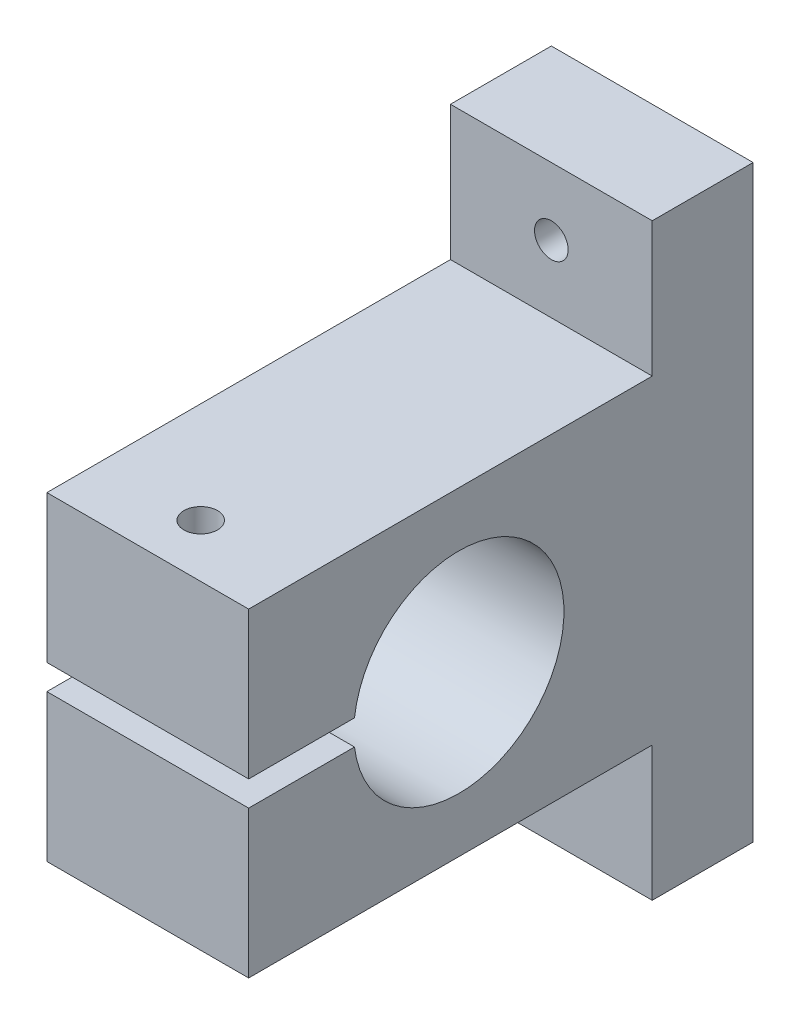
ISO-10303-21;
HEADER;
FILE_DESCRIPTION(('STEP AP214'),'2;1');
FILE_NAME('part.step','',(''),(''),'','','');
FILE_SCHEMA(('AUTOMOTIVE_DESIGN { 1 0 10303 214 1 1 1 1 }'));
ENDSEC;
DATA;
#1=APPLICATION_CONTEXT('core data for automotive mechanical design processes');
#2=APPLICATION_PROTOCOL_DEFINITION('international standard','automotive_design',2000,#1);
#3=PRODUCT_CONTEXT('',#1,'mechanical');
#4=PRODUCT('Part','Part','',(#3));
#5=PRODUCT_RELATED_PRODUCT_CATEGORY('part','',(#4));
#6=PRODUCT_DEFINITION_FORMATION('','',#4);
#7=PRODUCT_DEFINITION_CONTEXT('part definition',#1,'design');
#8=PRODUCT_DEFINITION('design','',#6,#7);
#9=PRODUCT_DEFINITION_SHAPE('','',#8);
#10=(LENGTH_UNIT() NAMED_UNIT(*) SI_UNIT(.MILLI.,.METRE.));
#11=(NAMED_UNIT(*) PLANE_ANGLE_UNIT() SI_UNIT($,.RADIAN.));
#12=(NAMED_UNIT(*) SI_UNIT($,.STERADIAN.) SOLID_ANGLE_UNIT());
#13=UNCERTAINTY_MEASURE_WITH_UNIT(LENGTH_MEASURE(1.E-05),#10,'distance_accuracy_value','');
#14=(GEOMETRIC_REPRESENTATION_CONTEXT(3) GLOBAL_UNCERTAINTY_ASSIGNED_CONTEXT((#13)) GLOBAL_UNIT_ASSIGNED_CONTEXT((#10,
#11,#12)) REPRESENTATION_CONTEXT('',''));
#15=CARTESIAN_POINT('',(0.,0.,0.));
#16=DIRECTION('',(0.,0.,1.));
#17=DIRECTION('',(1.,0.,0.));
#18=AXIS2_PLACEMENT_3D('',#15,#16,#17);
#19=CARTESIAN_POINT('',(24.,19.,25.));
#20=DIRECTION('',(0.,-1.,0.));
#21=DIRECTION('',(0.,0.,-1.));
#22=AXIS2_PLACEMENT_3D('',#19,#20,#21);
#23=PLANE('',#22);
#24=CARTESIAN_POINT('',(12.,19.,18.7048368229954));
#25=DIRECTION('',(0.,-1.,0.));
#26=DIRECTION('',(0.,0.,-1.));
#27=AXIS2_PLACEMENT_3D('',#24,#25,#26);
#28=CIRCLE('',#27,2.);
#29=CARTESIAN_POINT('',(12.,19.,20.7048368229954));
#30=VERTEX_POINT('',#29);
#31=EDGE_CURVE('E317',#30,#30,#28,.T.);
#32=ORIENTED_EDGE('',*,*,#31,.T.);
#33=EDGE_LOOP('',(#32));
#34=FACE_BOUND('',#33,.T.);
#35=DIRECTION('',(0.,0.,1.));
#36=VECTOR('',#35,1.);
#37=CARTESIAN_POINT('',(0.,19.,25.));
#38=LINE('',#37,#36);
#39=CARTESIAN_POINT('',(0.,19.,-23.));
#40=VERTEX_POINT('',#39);
#41=CARTESIAN_POINT('',(0.,19.,25.));
#42=VERTEX_POINT('',#41);
#43=EDGE_CURVE('E179',#40,#42,#38,.T.);
#44=ORIENTED_EDGE('',*,*,#43,.T.);
#45=DIRECTION('',(-1.,0.,0.));
#46=VECTOR('',#45,1.);
#47=CARTESIAN_POINT('',(24.,19.,25.));
#48=LINE('',#47,#46);
#49=CARTESIAN_POINT('',(24.,19.,25.));
#50=VERTEX_POINT('',#49);
#51=EDGE_CURVE('E13',#50,#42,#48,.T.);
#52=ORIENTED_EDGE('',*,*,#51,.F.);
#53=DIRECTION('',(0.,0.,1.));
#54=VECTOR('',#53,1.);
#55=CARTESIAN_POINT('',(24.,19.,25.));
#56=LINE('',#55,#54);
#57=CARTESIAN_POINT('',(24.,19.,-23.));
#58=VERTEX_POINT('',#57);
#59=EDGE_CURVE('E213',#58,#50,#56,.T.);
#60=ORIENTED_EDGE('',*,*,#59,.F.);
#61=DIRECTION('',(-1.,0.,0.));
#62=VECTOR('',#61,1.);
#63=CARTESIAN_POINT('',(24.,19.,-23.));
#64=LINE('',#63,#62);
#65=EDGE_CURVE('E175',#58,#40,#64,.T.);
#66=ORIENTED_EDGE('',*,*,#65,.T.);
#67=EDGE_LOOP('',(#44,#52,#60,#66));
#68=FACE_BOUND('',#67,.T.);
#69=ADVANCED_FACE('F53',(#34,#68),#23,.F.);
#70=CARTESIAN_POINT('',(24.,19.,25.));
#71=DIRECTION('',(0.,0.,-1.));
#72=DIRECTION('',(-1.,0.,0.));
#73=AXIS2_PLACEMENT_3D('',#70,#71,#72);
#74=PLANE('',#73);
#75=DIRECTION('',(0.,-1.,0.));
#76=VECTOR('',#75,1.);
#77=CARTESIAN_POINT('',(0.,19.,25.));
#78=LINE('',#77,#76);
#79=CARTESIAN_POINT('',(0.,1.5,25.));
#80=VERTEX_POINT('',#79);
#81=EDGE_CURVE('E183',#42,#80,#78,.T.);
#82=ORIENTED_EDGE('',*,*,#81,.T.);
#83=DIRECTION('',(-1.,0.,0.));
#84=VECTOR('',#83,1.);
#85=CARTESIAN_POINT('',(24.,1.5,25.));
#86=LINE('',#85,#84);
#87=CARTESIAN_POINT('',(24.,1.5,25.));
#88=VERTEX_POINT('',#87);
#89=EDGE_CURVE('E63',#88,#80,#86,.T.);
#90=ORIENTED_EDGE('',*,*,#89,.F.);
#91=DIRECTION('',(0.,-1.,0.));
#92=VECTOR('',#91,1.);
#93=CARTESIAN_POINT('',(24.,19.,25.));
#94=LINE('',#93,#92);
#95=EDGE_CURVE('E126',#50,#88,#94,.T.);
#96=ORIENTED_EDGE('',*,*,#95,.F.);
#97=ORIENTED_EDGE('',*,*,#51,.T.);
#98=EDGE_LOOP('',(#82,#90,#96,#97));
#99=FACE_BOUND('',#98,.T.);
#100=ADVANCED_FACE('F310',(#99),#74,.F.);
#101=CARTESIAN_POINT('',(24.,1.5,25.));
#102=DIRECTION('',(0.,1.,0.));
#103=DIRECTION('',(0.,0.,1.));
#104=AXIS2_PLACEMENT_3D('',#101,#102,#103);
#105=PLANE('',#104);
#106=CARTESIAN_POINT('',(12.,1.5,18.7048368229954));
#107=DIRECTION('',(0.,1.,0.));
#108=DIRECTION('',(0.,0.,1.));
#109=AXIS2_PLACEMENT_3D('',#106,#107,#108);
#110=CIRCLE('',#109,2.);
#111=CARTESIAN_POINT('',(12.,1.5,20.7048368229954));
#112=VERTEX_POINT('',#111);
#113=EDGE_CURVE('E320',#112,#112,#110,.F.);
#114=ORIENTED_EDGE('',*,*,#113,.F.);
#115=EDGE_LOOP('',(#114));
#116=FACE_BOUND('',#115,.T.);
#117=DIRECTION('',(0.,0.,-1.));
#118=VECTOR('',#117,1.);
#119=CARTESIAN_POINT('',(0.,1.5,25.));
#120=LINE('',#119,#118);
#121=CARTESIAN_POINT('',(0.,1.5,12.4096736459909));
#122=VERTEX_POINT('',#121);
#123=EDGE_CURVE('E186',#80,#122,#120,.T.);
#124=ORIENTED_EDGE('',*,*,#123,.T.);
#125=DIRECTION('',(-1.,0.,0.));
#126=VECTOR('',#125,1.);
#127=CARTESIAN_POINT('',(24.,1.5,12.4096736459909));
#128=LINE('',#127,#126);
#129=CARTESIAN_POINT('',(24.,1.5,12.4096736459909));
#130=VERTEX_POINT('',#129);
#131=EDGE_CURVE('E240',#130,#122,#128,.T.);
#132=ORIENTED_EDGE('',*,*,#131,.F.);
#133=DIRECTION('',(0.,0.,-1.));
#134=VECTOR('',#133,1.);
#135=CARTESIAN_POINT('',(24.,1.5,25.));
#136=LINE('',#135,#134);
#137=EDGE_CURVE('E251',#88,#130,#136,.T.);
#138=ORIENTED_EDGE('',*,*,#137,.F.);
#139=ORIENTED_EDGE('',*,*,#89,.T.);
#140=EDGE_LOOP('',(#124,#132,#138,#139));
#141=FACE_BOUND('',#140,.T.);
#142=ADVANCED_FACE('F249',(#116,#141),#105,.F.);
#143=CARTESIAN_POINT('',(24.,0.,0.));
#144=DIRECTION('',(-1.,0.,0.));
#145=DIRECTION('',(0.,0.,1.));
#146=AXIS2_PLACEMENT_3D('',#143,#144,#145);
#147=CYLINDRICAL_SURFACE('',#146,12.5);
#148=CARTESIAN_POINT('',(0.,0.,0.));
#149=DIRECTION('',(-1.,0.,0.));
#150=DIRECTION('',(0.,0.,-1.));
#151=AXIS2_PLACEMENT_3D('',#148,#149,#150);
#152=CIRCLE('',#151,12.5);
#153=CARTESIAN_POINT('',(0.,-1.5,12.4096736459909));
#154=VERTEX_POINT('',#153);
#155=EDGE_CURVE('E189',#122,#154,#152,.T.);
#156=ORIENTED_EDGE('',*,*,#155,.T.);
#157=DIRECTION('',(-1.,0.,0.));
#158=VECTOR('',#157,1.);
#159=CARTESIAN_POINT('',(24.,-1.5,12.4096736459909));
#160=LINE('',#159,#158);
#161=CARTESIAN_POINT('',(24.,-1.5,12.4096736459909));
#162=VERTEX_POINT('',#161);
#163=EDGE_CURVE('E236',#162,#154,#160,.T.);
#164=ORIENTED_EDGE('',*,*,#163,.F.);
#165=CARTESIAN_POINT('',(24.,0.,0.));
#166=DIRECTION('',(-1.,0.,0.));
#167=DIRECTION('',(0.,0.,-1.));
#168=AXIS2_PLACEMENT_3D('',#165,#166,#167);
#169=CIRCLE('',#168,12.5);
#170=EDGE_CURVE('E270',#130,#162,#169,.T.);
#171=ORIENTED_EDGE('',*,*,#170,.F.);
#172=ORIENTED_EDGE('',*,*,#131,.T.);
#173=EDGE_LOOP('',(#156,#164,#171,#172));
#174=FACE_BOUND('',#173,.T.);
#175=ADVANCED_FACE('F260',(#174),#147,.F.);
#176=CARTESIAN_POINT('',(24.,-1.5,25.));
#177=DIRECTION('',(0.,-1.,0.));
#178=DIRECTION('',(0.,0.,-1.));
#179=AXIS2_PLACEMENT_3D('',#176,#177,#178);
#180=PLANE('',#179);
#181=CARTESIAN_POINT('',(12.,-1.5,18.7048368229954));
#182=DIRECTION('',(0.,-1.,0.));
#183=DIRECTION('',(0.,0.,-1.));
#184=AXIS2_PLACEMENT_3D('',#181,#182,#183);
#185=CIRCLE('',#184,2.);
#186=CARTESIAN_POINT('',(12.,-1.5,16.7048368229954));
#187=VERTEX_POINT('',#186);
#188=EDGE_CURVE('E337',#187,#187,#185,.F.);
#189=ORIENTED_EDGE('',*,*,#188,.F.);
#190=EDGE_LOOP('',(#189));
#191=FACE_BOUND('',#190,.T.);
#192=DIRECTION('',(0.,0.,1.));
#193=VECTOR('',#192,1.);
#194=CARTESIAN_POINT('',(0.,-1.5,25.));
#195=LINE('',#194,#193);
#196=CARTESIAN_POINT('',(0.,-1.5,25.));
#197=VERTEX_POINT('',#196);
#198=EDGE_CURVE('E192',#154,#197,#195,.T.);
#199=ORIENTED_EDGE('',*,*,#198,.T.);
#200=DIRECTION('',(-1.,0.,0.));
#201=VECTOR('',#200,1.);
#202=CARTESIAN_POINT('',(24.,-1.5,25.));
#203=LINE('',#202,#201);
#204=CARTESIAN_POINT('',(24.,-1.5,25.));
#205=VERTEX_POINT('',#204);
#206=EDGE_CURVE('E232',#205,#197,#203,.T.);
#207=ORIENTED_EDGE('',*,*,#206,.F.);
#208=DIRECTION('',(0.,0.,1.));
#209=VECTOR('',#208,1.);
#210=CARTESIAN_POINT('',(24.,-1.5,25.));
#211=LINE('',#210,#209);
#212=EDGE_CURVE('E266',#162,#205,#211,.T.);
#213=ORIENTED_EDGE('',*,*,#212,.F.);
#214=ORIENTED_EDGE('',*,*,#163,.T.);
#215=EDGE_LOOP('',(#199,#207,#213,#214));
#216=FACE_BOUND('',#215,.T.);
#217=ADVANCED_FACE('F264',(#191,#216),#180,.F.);
#218=CARTESIAN_POINT('',(24.,-19.,25.));
#219=DIRECTION('',(0.,0.,-1.));
#220=DIRECTION('',(-1.,0.,0.));
#221=AXIS2_PLACEMENT_3D('',#218,#219,#220);
#222=PLANE('',#221);
#223=DIRECTION('',(0.,-1.,0.));
#224=VECTOR('',#223,1.);
#225=CARTESIAN_POINT('',(0.,-19.,25.));
#226=LINE('',#225,#224);
#227=CARTESIAN_POINT('',(0.,-19.,25.));
#228=VERTEX_POINT('',#227);
#229=EDGE_CURVE('E195',#197,#228,#226,.T.);
#230=ORIENTED_EDGE('',*,*,#229,.T.);
#231=DIRECTION('',(-1.,0.,0.));
#232=VECTOR('',#231,1.);
#233=CARTESIAN_POINT('',(24.,-19.,25.));
#234=LINE('',#233,#232);
#235=CARTESIAN_POINT('',(24.,-19.,25.));
#236=VERTEX_POINT('',#235);
#237=EDGE_CURVE('E228',#236,#228,#234,.T.);
#238=ORIENTED_EDGE('',*,*,#237,.F.);
#239=DIRECTION('',(0.,-1.,0.));
#240=VECTOR('',#239,1.);
#241=CARTESIAN_POINT('',(24.,-19.,25.));
#242=LINE('',#241,#240);
#243=EDGE_CURVE('E269',#205,#236,#242,.T.);
#244=ORIENTED_EDGE('',*,*,#243,.F.);
#245=ORIENTED_EDGE('',*,*,#206,.T.);
#246=EDGE_LOOP('',(#230,#238,#244,#245));
#247=FACE_BOUND('',#246,.T.);
#248=ADVANCED_FACE('F386',(#247),#222,.F.);
#249=CARTESIAN_POINT('',(24.,-19.,25.));
#250=DIRECTION('',(0.,1.,0.));
#251=DIRECTION('',(0.,0.,1.));
#252=AXIS2_PLACEMENT_3D('',#249,#250,#251);
#253=PLANE('',#252);
#254=CARTESIAN_POINT('',(12.,-19.,18.7048368229954));
#255=DIRECTION('',(0.,-1.,0.));
#256=DIRECTION('',(0.,0.,-1.));
#257=AXIS2_PLACEMENT_3D('',#254,#255,#256);
#258=CIRCLE('',#257,2.);
#259=CARTESIAN_POINT('',(12.,-19.,16.7048368229954));
#260=VERTEX_POINT('',#259);
#261=EDGE_CURVE('E333',#260,#260,#258,.T.);
#262=ORIENTED_EDGE('',*,*,#261,.F.);
#263=EDGE_LOOP('',(#262));
#264=FACE_BOUND('',#263,.T.);
#265=DIRECTION('',(0.,0.,-1.));
#266=VECTOR('',#265,1.);
#267=CARTESIAN_POINT('',(0.,-19.,25.));
#268=LINE('',#267,#266);
#269=CARTESIAN_POINT('',(0.,-19.,-23.));
#270=VERTEX_POINT('',#269);
#271=EDGE_CURVE('E198',#228,#270,#268,.T.);
#272=ORIENTED_EDGE('',*,*,#271,.T.);
#273=DIRECTION('',(-1.,0.,0.));
#274=VECTOR('',#273,1.);
#275=CARTESIAN_POINT('',(24.,-19.,-23.));
#276=LINE('',#275,#274);
#277=CARTESIAN_POINT('',(24.,-19.,-23.));
#278=VERTEX_POINT('',#277);
#279=EDGE_CURVE('E224',#278,#270,#276,.T.);
#280=ORIENTED_EDGE('',*,*,#279,.F.);
#281=DIRECTION('',(0.,0.,-1.));
#282=VECTOR('',#281,1.);
#283=CARTESIAN_POINT('',(24.,-19.,25.));
#284=LINE('',#283,#282);
#285=EDGE_CURVE('E274',#236,#278,#284,.T.);
#286=ORIENTED_EDGE('',*,*,#285,.F.);
#287=ORIENTED_EDGE('',*,*,#237,.T.);
#288=EDGE_LOOP('',(#272,#280,#286,#287));
#289=FACE_BOUND('',#288,.T.);
#290=ADVANCED_FACE('F390',(#264,#289),#253,.F.);
#291=CARTESIAN_POINT('',(24.,-19.,-23.));
#292=DIRECTION('',(0.,0.,-1.));
#293=DIRECTION('',(0.,1.,0.));
#294=AXIS2_PLACEMENT_3D('',#291,#292,#293);
#295=PLANE('',#294);
#296=CARTESIAN_POINT('',(12.,-27.,-23.));
#297=DIRECTION('',(0.,0.,1.));
#298=DIRECTION('',(1.,0.,0.));
#299=AXIS2_PLACEMENT_3D('',#296,#297,#298);
#300=CIRCLE('',#299,2.);
#301=CARTESIAN_POINT('',(14.,-27.,-23.));
#302=VERTEX_POINT('',#301);
#303=EDGE_CURVE('E341',#302,#302,#300,.T.);
#304=ORIENTED_EDGE('',*,*,#303,.F.);
#305=EDGE_LOOP('',(#304));
#306=FACE_BOUND('',#305,.T.);
#307=DIRECTION('',(0.,-1.,0.));
#308=VECTOR('',#307,1.);
#309=CARTESIAN_POINT('',(0.,-19.,-23.));
#310=LINE('',#309,#308);
#311=CARTESIAN_POINT('',(0.,-35.,-23.));
#312=VERTEX_POINT('',#311);
#313=EDGE_CURVE('E201',#270,#312,#310,.T.);
#314=ORIENTED_EDGE('',*,*,#313,.T.);
#315=DIRECTION('',(-1.,0.,0.));
#316=VECTOR('',#315,1.);
#317=CARTESIAN_POINT('',(24.,-35.,-23.));
#318=LINE('',#317,#316);
#319=CARTESIAN_POINT('',(24.,-35.,-23.));
#320=VERTEX_POINT('',#319);
#321=EDGE_CURVE('E220',#320,#312,#318,.T.);
#322=ORIENTED_EDGE('',*,*,#321,.F.);
#323=DIRECTION('',(0.,-1.,0.));
#324=VECTOR('',#323,1.);
#325=CARTESIAN_POINT('',(24.,-19.,-23.));
#326=LINE('',#325,#324);
#327=EDGE_CURVE('E281',#278,#320,#326,.T.);
#328=ORIENTED_EDGE('',*,*,#327,.F.);
#329=ORIENTED_EDGE('',*,*,#279,.T.);
#330=EDGE_LOOP('',(#314,#322,#328,#329));
#331=FACE_BOUND('',#330,.T.);
#332=ADVANCED_FACE('F289',(#306,#331),#295,.F.);
#333=CARTESIAN_POINT('',(24.,-35.,-23.));
#334=DIRECTION('',(0.,1.,0.));
#335=DIRECTION('',(0.,0.,1.));
#336=AXIS2_PLACEMENT_3D('',#333,#334,#335);
#337=PLANE('',#336);
#338=DIRECTION('',(0.,0.,-1.));
#339=VECTOR('',#338,1.);
#340=CARTESIAN_POINT('',(0.,-35.,-23.));
#341=LINE('',#340,#339);
#342=CARTESIAN_POINT('',(0.,-35.,-35.));
#343=VERTEX_POINT('',#342);
#344=EDGE_CURVE('E204',#312,#343,#341,.T.);
#345=ORIENTED_EDGE('',*,*,#344,.T.);
#346=DIRECTION('',(-1.,0.,0.));
#347=VECTOR('',#346,1.);
#348=CARTESIAN_POINT('',(24.,-35.,-35.));
#349=LINE('',#348,#347);
#350=CARTESIAN_POINT('',(24.,-35.,-35.));
#351=VERTEX_POINT('',#350);
#352=EDGE_CURVE('E168',#351,#343,#349,.T.);
#353=ORIENTED_EDGE('',*,*,#352,.F.);
#354=DIRECTION('',(0.,0.,-1.));
#355=VECTOR('',#354,1.);
#356=CARTESIAN_POINT('',(24.,-35.,-23.));
#357=LINE('',#356,#355);
#358=EDGE_CURVE('E157',#320,#351,#357,.T.);
#359=ORIENTED_EDGE('',*,*,#358,.F.);
#360=ORIENTED_EDGE('',*,*,#321,.T.);
#361=EDGE_LOOP('',(#345,#353,#359,#360));
#362=FACE_BOUND('',#361,.T.);
#363=ADVANCED_FACE('F293',(#362),#337,.F.);
#364=CARTESIAN_POINT('',(24.,35.,-35.));
#365=DIRECTION('',(0.,0.,1.));
#366=DIRECTION('',(1.,0.,0.));
#367=AXIS2_PLACEMENT_3D('',#364,#365,#366);
#368=PLANE('',#367);
#369=CARTESIAN_POINT('',(12.,27.,-35.));
#370=DIRECTION('',(0.,0.,1.));
#371=DIRECTION('',(1.,0.,0.));
#372=AXIS2_PLACEMENT_3D('',#369,#370,#371);
#373=CIRCLE('',#372,2.);
#374=CARTESIAN_POINT('',(14.,27.,-35.));
#375=VERTEX_POINT('',#374);
#376=EDGE_CURVE('E329',#375,#375,#373,.F.);
#377=ORIENTED_EDGE('',*,*,#376,.F.);
#378=EDGE_LOOP('',(#377));
#379=FACE_BOUND('',#378,.T.);
#380=CARTESIAN_POINT('',(12.,-27.,-35.));
#381=DIRECTION('',(0.,0.,1.));
#382=DIRECTION('',(1.,0.,0.));
#383=AXIS2_PLACEMENT_3D('',#380,#381,#382);
#384=CIRCLE('',#383,2.);
#385=CARTESIAN_POINT('',(14.,-27.,-35.));
#386=VERTEX_POINT('',#385);
#387=EDGE_CURVE('E56',#386,#386,#384,.T.);
#388=ORIENTED_EDGE('',*,*,#387,.T.);
#389=EDGE_LOOP('',(#388));
#390=FACE_BOUND('',#389,.T.);
#391=DIRECTION('',(0.,1.,0.));
#392=VECTOR('',#391,1.);
#393=CARTESIAN_POINT('',(0.,35.,-35.));
#394=LINE('',#393,#392);
#395=CARTESIAN_POINT('',(0.,35.,-35.));
#396=VERTEX_POINT('',#395);
#397=EDGE_CURVE('E166',#343,#396,#394,.T.);
#398=ORIENTED_EDGE('',*,*,#397,.T.);
#399=DIRECTION('',(-1.,0.,0.));
#400=VECTOR('',#399,1.);
#401=CARTESIAN_POINT('',(24.,35.,-35.));
#402=LINE('',#401,#400);
#403=CARTESIAN_POINT('',(24.,35.,-35.));
#404=VERTEX_POINT('',#403);
#405=EDGE_CURVE('E163',#404,#396,#402,.T.);
#406=ORIENTED_EDGE('',*,*,#405,.F.);
#407=DIRECTION('',(0.,1.,0.));
#408=VECTOR('',#407,1.);
#409=CARTESIAN_POINT('',(24.,35.,-35.));
#410=LINE('',#409,#408);
#411=EDGE_CURVE('E151',#351,#404,#410,.T.);
#412=ORIENTED_EDGE('',*,*,#411,.F.);
#413=ORIENTED_EDGE('',*,*,#352,.T.);
#414=EDGE_LOOP('',(#398,#406,#412,#413));
#415=FACE_BOUND('',#414,.T.);
#416=ADVANCED_FACE('F164',(#379,#390,#415),#368,.F.);
#417=CARTESIAN_POINT('',(24.,35.,-23.));
#418=DIRECTION('',(0.,-1.,0.));
#419=DIRECTION('',(0.,0.,-1.));
#420=AXIS2_PLACEMENT_3D('',#417,#418,#419);
#421=PLANE('',#420);
#422=DIRECTION('',(0.,0.,1.));
#423=VECTOR('',#422,1.);
#424=CARTESIAN_POINT('',(0.,35.,-23.));
#425=LINE('',#424,#423);
#426=CARTESIAN_POINT('',(0.,35.,-23.));
#427=VERTEX_POINT('',#426);
#428=EDGE_CURVE('E112',#396,#427,#425,.T.);
#429=ORIENTED_EDGE('',*,*,#428,.T.);
#430=DIRECTION('',(-1.,0.,0.));
#431=VECTOR('',#430,1.);
#432=CARTESIAN_POINT('',(24.,35.,-23.));
#433=LINE('',#432,#431);
#434=CARTESIAN_POINT('',(24.,35.,-23.));
#435=VERTEX_POINT('',#434);
#436=EDGE_CURVE('E169',#435,#427,#433,.T.);
#437=ORIENTED_EDGE('',*,*,#436,.F.);
#438=DIRECTION('',(0.,0.,1.));
#439=VECTOR('',#438,1.);
#440=CARTESIAN_POINT('',(24.,35.,-23.));
#441=LINE('',#440,#439);
#442=EDGE_CURVE('E155',#404,#435,#441,.T.);
#443=ORIENTED_EDGE('',*,*,#442,.F.);
#444=ORIENTED_EDGE('',*,*,#405,.T.);
#445=EDGE_LOOP('',(#429,#437,#443,#444));
#446=FACE_BOUND('',#445,.T.);
#447=ADVANCED_FACE('F171',(#446),#421,.F.);
#448=CARTESIAN_POINT('',(24.,35.,-23.));
#449=DIRECTION('',(0.,0.,-1.));
#450=DIRECTION('',(0.,1.,0.));
#451=AXIS2_PLACEMENT_3D('',#448,#449,#450);
#452=PLANE('',#451);
#453=CARTESIAN_POINT('',(12.,27.,-23.));
#454=DIRECTION('',(0.,0.,-1.));
#455=DIRECTION('',(1.,0.,0.));
#456=AXIS2_PLACEMENT_3D('',#453,#454,#455);
#457=CIRCLE('',#456,2.);
#458=CARTESIAN_POINT('',(14.,27.,-23.));
#459=VERTEX_POINT('',#458);
#460=EDGE_CURVE('E324',#459,#459,#457,.T.);
#461=ORIENTED_EDGE('',*,*,#460,.T.);
#462=EDGE_LOOP('',(#461));
#463=FACE_BOUND('',#462,.T.);
#464=DIRECTION('',(0.,-1.,0.));
#465=VECTOR('',#464,1.);
#466=CARTESIAN_POINT('',(0.,35.,-23.));
#467=LINE('',#466,#465);
#468=EDGE_CURVE('E118',#427,#40,#467,.T.);
#469=ORIENTED_EDGE('',*,*,#468,.T.);
#470=ORIENTED_EDGE('',*,*,#65,.F.);
#471=DIRECTION('',(0.,-1.,0.));
#472=VECTOR('',#471,1.);
#473=CARTESIAN_POINT('',(24.,35.,-23.));
#474=LINE('',#473,#472);
#475=EDGE_CURVE('E71',#435,#58,#474,.T.);
#476=ORIENTED_EDGE('',*,*,#475,.F.);
#477=ORIENTED_EDGE('',*,*,#436,.T.);
#478=EDGE_LOOP('',(#469,#470,#476,#477));
#479=FACE_BOUND('',#478,.T.);
#480=ADVANCED_FACE('F297',(#463,#479),#452,.F.);
#481=CARTESIAN_POINT('',(24.,0.,0.));
#482=DIRECTION('',(1.,0.,0.));
#483=DIRECTION('',(0.,0.,-1.));
#484=AXIS2_PLACEMENT_3D('',#481,#482,#483);
#485=PLANE('',#484);
#486=ORIENTED_EDGE('',*,*,#59,.T.);
#487=ORIENTED_EDGE('',*,*,#95,.T.);
#488=ORIENTED_EDGE('',*,*,#137,.T.);
#489=ORIENTED_EDGE('',*,*,#170,.T.);
#490=ORIENTED_EDGE('',*,*,#212,.T.);
#491=ORIENTED_EDGE('',*,*,#243,.T.);
#492=ORIENTED_EDGE('',*,*,#285,.T.);
#493=ORIENTED_EDGE('',*,*,#327,.T.);
#494=ORIENTED_EDGE('',*,*,#358,.T.);
#495=ORIENTED_EDGE('',*,*,#411,.T.);
#496=ORIENTED_EDGE('',*,*,#442,.T.);
#497=ORIENTED_EDGE('',*,*,#475,.T.);
#498=EDGE_LOOP('',(#486,#487,#488,#489,#490,#491,#492,#493,#494,#495,#496,#497));
#499=FACE_BOUND('',#498,.T.);
#500=ADVANCED_FACE('F153',(#499),#485,.T.);
#501=CARTESIAN_POINT('',(0.,0.,0.));
#502=DIRECTION('',(1.,0.,0.));
#503=DIRECTION('',(0.,0.,-1.));
#504=AXIS2_PLACEMENT_3D('',#501,#502,#503);
#505=PLANE('',#504);
#506=ORIENTED_EDGE('',*,*,#43,.F.);
#507=ORIENTED_EDGE('',*,*,#468,.F.);
#508=ORIENTED_EDGE('',*,*,#428,.F.);
#509=ORIENTED_EDGE('',*,*,#397,.F.);
#510=ORIENTED_EDGE('',*,*,#344,.F.);
#511=ORIENTED_EDGE('',*,*,#313,.F.);
#512=ORIENTED_EDGE('',*,*,#271,.F.);
#513=ORIENTED_EDGE('',*,*,#229,.F.);
#514=ORIENTED_EDGE('',*,*,#198,.F.);
#515=ORIENTED_EDGE('',*,*,#155,.F.);
#516=ORIENTED_EDGE('',*,*,#123,.F.);
#517=ORIENTED_EDGE('',*,*,#81,.F.);
#518=EDGE_LOOP('',(#506,#507,#508,#509,#510,#511,#512,#513,#514,#515,#516,#517));
#519=FACE_BOUND('',#518,.T.);
#520=ADVANCED_FACE('F255',(#519),#505,.F.);
#521=CARTESIAN_POINT('',(12.,-27.,-43.));
#522=DIRECTION('',(0.,0.,1.));
#523=DIRECTION('',(1.,0.,0.));
#524=AXIS2_PLACEMENT_3D('',#521,#522,#523);
#525=CYLINDRICAL_SURFACE('',#524,2.);
#526=ORIENTED_EDGE('',*,*,#303,.T.);
#527=EDGE_LOOP('',(#526));
#528=FACE_BOUND('',#527,.T.);
#529=ORIENTED_EDGE('',*,*,#387,.F.);
#530=EDGE_LOOP('',(#529));
#531=FACE_BOUND('',#530,.T.);
#532=ADVANCED_FACE('F354',(#528,#531),#525,.F.);
#533=CARTESIAN_POINT('',(12.,4.15685424949238,18.7048368229954));
#534=DIRECTION('',(0.,-1.,0.));
#535=DIRECTION('',(0.,0.,-1.));
#536=AXIS2_PLACEMENT_3D('',#533,#534,#535);
#537=CYLINDRICAL_SURFACE('',#536,2.);
#538=ORIENTED_EDGE('',*,*,#188,.T.);
#539=EDGE_LOOP('',(#538));
#540=FACE_BOUND('',#539,.T.);
#541=ORIENTED_EDGE('',*,*,#261,.T.);
#542=EDGE_LOOP('',(#541));
#543=FACE_BOUND('',#542,.T.);
#544=ADVANCED_FACE('F356',(#540,#543),#537,.F.);
#545=CARTESIAN_POINT('',(12.,27.,-43.));
#546=DIRECTION('',(0.,0.,1.));
#547=DIRECTION('',(1.,0.,0.));
#548=AXIS2_PLACEMENT_3D('',#545,#546,#547);
#549=CYLINDRICAL_SURFACE('',#548,2.);
#550=ORIENTED_EDGE('',*,*,#460,.F.);
#551=EDGE_LOOP('',(#550));
#552=FACE_BOUND('',#551,.T.);
#553=ORIENTED_EDGE('',*,*,#376,.T.);
#554=EDGE_LOOP('',(#553));
#555=FACE_BOUND('',#554,.T.);
#556=ADVANCED_FACE('F363',(#552,#555),#549,.F.);
#557=CARTESIAN_POINT('',(12.,-7.15685424949238,18.7048368229954));
#558=DIRECTION('',(0.,1.,0.));
#559=DIRECTION('',(0.,0.,1.));
#560=AXIS2_PLACEMENT_3D('',#557,#558,#559);
#561=CYLINDRICAL_SURFACE('',#560,2.);
#562=CARTESIAN_POINT('',(12.,19.,20.7048368229954));
#563=CARTESIAN_POINT('',(12.,18.8177083333333,20.7048368229954));
#564=CARTESIAN_POINT('',(12.,18.6354166666667,20.7048368229954));
#565=CARTESIAN_POINT('',(12.,18.2708333333333,20.7048368229954));
#566=CARTESIAN_POINT('',(12.,18.0885416666667,20.7048368229954));
#567=CARTESIAN_POINT('',(12.,17.7239583333333,20.7048368229954));
#568=CARTESIAN_POINT('',(12.,17.5416666666667,20.7048368229954));
#569=CARTESIAN_POINT('',(12.,17.1770833333333,20.7048368229954));
#570=CARTESIAN_POINT('',(12.,16.9947916666667,20.7048368229954));
#571=CARTESIAN_POINT('',(12.,16.6302083333333,20.7048368229954));
#572=CARTESIAN_POINT('',(12.,16.4479166666667,20.7048368229954));
#573=CARTESIAN_POINT('',(12.,16.0833333333333,20.7048368229954));
#574=CARTESIAN_POINT('',(12.,15.9010416666667,20.7048368229954));
#575=CARTESIAN_POINT('',(12.,15.5364583333333,20.7048368229954));
#576=CARTESIAN_POINT('',(12.,15.3541666666667,20.7048368229954));
#577=CARTESIAN_POINT('',(12.,14.9895833333333,20.7048368229954));
#578=CARTESIAN_POINT('',(12.,14.8072916666667,20.7048368229954));
#579=CARTESIAN_POINT('',(12.,14.4427083333333,20.7048368229954));
#580=CARTESIAN_POINT('',(12.,14.2604166666667,20.7048368229954));
#581=CARTESIAN_POINT('',(12.,13.8958333333333,20.7048368229954));
#582=CARTESIAN_POINT('',(12.,13.7135416666667,20.7048368229954));
#583=CARTESIAN_POINT('',(12.,13.3489583333333,20.7048368229954));
#584=CARTESIAN_POINT('',(12.,13.1666666666667,20.7048368229954));
#585=CARTESIAN_POINT('',(12.,12.8020833333333,20.7048368229954));
#586=CARTESIAN_POINT('',(12.,12.6197916666667,20.7048368229954));
#587=CARTESIAN_POINT('',(12.,12.2552083333333,20.7048368229954));
#588=CARTESIAN_POINT('',(12.,12.0729166666667,20.7048368229954));
#589=CARTESIAN_POINT('',(12.,11.7083333333333,20.7048368229954));
#590=CARTESIAN_POINT('',(12.,11.5260416666667,20.7048368229954));
#591=CARTESIAN_POINT('',(12.,11.1614583333333,20.7048368229954));
#592=CARTESIAN_POINT('',(12.,10.9791666666667,20.7048368229954));
#593=CARTESIAN_POINT('',(12.,10.6145833333333,20.7048368229954));
#594=CARTESIAN_POINT('',(12.,10.4322916666667,20.7048368229954));
#595=CARTESIAN_POINT('',(12.,10.0677083333333,20.7048368229954));
#596=CARTESIAN_POINT('',(12.,9.88541666666667,20.7048368229954));
#597=CARTESIAN_POINT('',(12.,9.52083333333333,20.7048368229954));
#598=CARTESIAN_POINT('',(12.,9.33854166666667,20.7048368229954));
#599=CARTESIAN_POINT('',(12.,8.97395833333334,20.7048368229954));
#600=CARTESIAN_POINT('',(12.,8.79166666666667,20.7048368229954));
#601=CARTESIAN_POINT('',(12.,8.42708333333334,20.7048368229954));
#602=CARTESIAN_POINT('',(12.,8.24479166666667,20.7048368229954));
#603=CARTESIAN_POINT('',(12.,7.88020833333334,20.7048368229954));
#604=CARTESIAN_POINT('',(12.,7.69791666666667,20.7048368229954));
#605=CARTESIAN_POINT('',(12.,7.33333333333334,20.7048368229954));
#606=CARTESIAN_POINT('',(12.,7.15104166666667,20.7048368229954));
#607=CARTESIAN_POINT('',(12.,6.78645833333334,20.7048368229954));
#608=CARTESIAN_POINT('',(12.,6.60416666666667,20.7048368229954));
#609=CARTESIAN_POINT('',(12.,6.23958333333334,20.7048368229954));
#610=CARTESIAN_POINT('',(12.,6.05729166666667,20.7048368229954));
#611=CARTESIAN_POINT('',(12.,5.69270833333334,20.7048368229954));
#612=CARTESIAN_POINT('',(12.,5.51041666666667,20.7048368229954));
#613=CARTESIAN_POINT('',(12.,5.14583333333334,20.7048368229954));
#614=CARTESIAN_POINT('',(12.,4.96354166666667,20.7048368229954));
#615=CARTESIAN_POINT('',(12.,4.59895833333334,20.7048368229954));
#616=CARTESIAN_POINT('',(12.,4.41666666666667,20.7048368229954));
#617=CARTESIAN_POINT('',(12.,4.05208333333334,20.7048368229954));
#618=CARTESIAN_POINT('',(12.,3.86979166666667,20.7048368229954));
#619=CARTESIAN_POINT('',(12.,3.50520833333334,20.7048368229954));
#620=CARTESIAN_POINT('',(12.,3.32291666666667,20.7048368229954));
#621=CARTESIAN_POINT('',(12.,2.95833333333334,20.7048368229954));
#622=CARTESIAN_POINT('',(12.,2.77604166666667,20.7048368229954));
#623=CARTESIAN_POINT('',(12.,2.41145833333334,20.7048368229954));
#624=CARTESIAN_POINT('',(12.,2.22916666666667,20.7048368229954));
#625=CARTESIAN_POINT('',(12.,1.86458333333334,20.7048368229954));
#626=CARTESIAN_POINT('',(12.,1.68229166666667,20.7048368229954));
#627=CARTESIAN_POINT('',(12.,1.5,20.7048368229954));
#628=B_SPLINE_CURVE_WITH_KNOTS('',3,(#562,#563,#564,#565,#566,#567,#568,#569,#570,#571,#572,
#573,#574,#575,#576,#577,#578,#579,#580,#581,#582,#583,#584,#585,#586,#587,#588,#589,#590,#591,
#592,#593,#594,#595,#596,#597,#598,#599,#600,#601,#602,#603,#604,#605,#606,#607,#608,#609,#610,
#611,#612,#613,#614,#615,#616,#617,#618,#619,#620,#621,#622,#623,#624,#625,#626,#627),
.UNSPECIFIED.,.F.,.F.,(4,2,2,2,2,2,2,2,2,2,2,2,2,2,2,2,2,2,2,2,2,2,2,2,2,2,2,2,2,2,2,2,4),(0.,
0.546874999999999,1.09375,1.640625,2.1875,2.734375,3.28125,3.828125,4.375,4.921875,5.46875,
6.015625,6.5625,7.109375,7.65625,8.203125,8.75,9.296875,9.84375,10.390625,10.9375,11.484375,
12.03125,12.578125,13.125,13.671875,14.21875,14.765625,15.3125,15.859375,16.40625,16.953125,
17.5),.UNSPECIFIED.);
#629=EDGE_CURVE('BSEAM369',#30,#112,#628,.T.);
#630=ORIENTED_EDGE('',*,*,#31,.F.);
#631=ORIENTED_EDGE('',*,*,#113,.T.);
#632=ORIENTED_EDGE('',*,*,#629,.T.);
#633=ORIENTED_EDGE('',*,*,#629,.F.);
#634=EDGE_LOOP('',(#630,#632,#631,#633));
#635=FACE_BOUND('',#634,.T.);
#636=ADVANCED_FACE('F369',(#635),#561,.F.);
#637=CLOSED_SHELL('',(#69,#100,#142,#175,#217,#248,#290,#332,#363,#416,#447,#480,#500,#520,#532,
#544,#556,#636));
#638=MANIFOLD_SOLID_BREP('B2',#637);
#639=ADVANCED_BREP_SHAPE_REPRESENTATION('',(#18,#638),#14);
#640=SHAPE_DEFINITION_REPRESENTATION(#9,#639);
ENDSEC;
END-ISO-10303-21;
